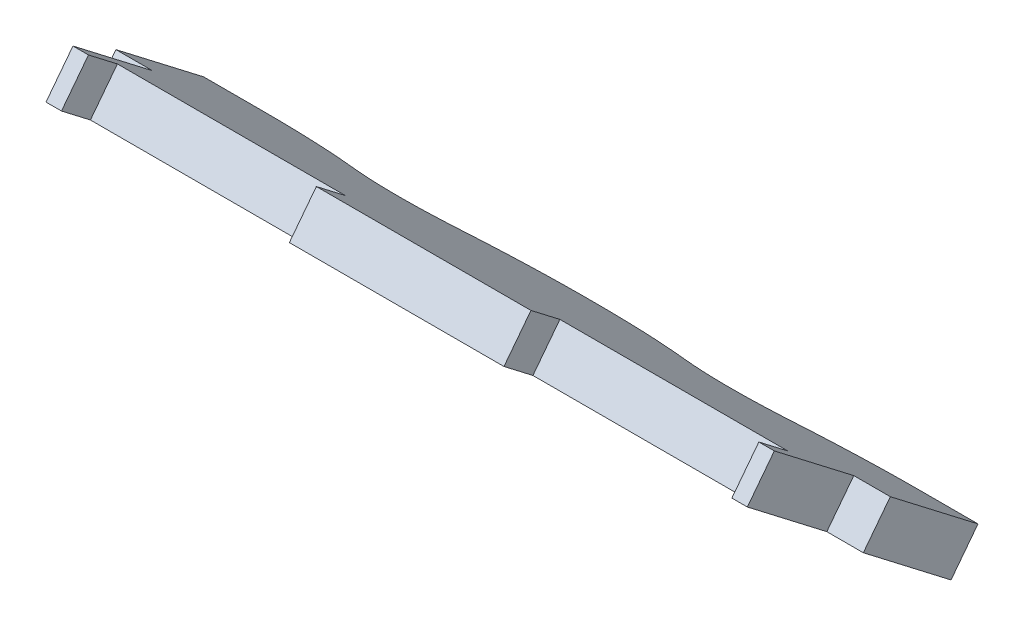
ISO-10303-21;
HEADER;
FILE_DESCRIPTION(('STEP AP214'),'2;1');
FILE_NAME('part.step','',(''),(''),'','','');
FILE_SCHEMA(('AUTOMOTIVE_DESIGN { 1 0 10303 214 1 1 1 1 }'));
ENDSEC;
DATA;
#1=APPLICATION_CONTEXT('core data for automotive mechanical design processes');
#2=APPLICATION_PROTOCOL_DEFINITION('international standard','automotive_design',2000,#1);
#3=PRODUCT_CONTEXT('',#1,'mechanical');
#4=PRODUCT('Part','Part','',(#3));
#5=PRODUCT_RELATED_PRODUCT_CATEGORY('part','',(#4));
#6=PRODUCT_DEFINITION_FORMATION('','',#4);
#7=PRODUCT_DEFINITION_CONTEXT('part definition',#1,'design');
#8=PRODUCT_DEFINITION('design','',#6,#7);
#9=PRODUCT_DEFINITION_SHAPE('','',#8);
#10=(LENGTH_UNIT() NAMED_UNIT(*) SI_UNIT(.MILLI.,.METRE.));
#11=(NAMED_UNIT(*) PLANE_ANGLE_UNIT() SI_UNIT($,.RADIAN.));
#12=(NAMED_UNIT(*) SI_UNIT($,.STERADIAN.) SOLID_ANGLE_UNIT());
#13=UNCERTAINTY_MEASURE_WITH_UNIT(LENGTH_MEASURE(1.E-05),#10,'distance_accuracy_value','');
#14=(GEOMETRIC_REPRESENTATION_CONTEXT(3) GLOBAL_UNCERTAINTY_ASSIGNED_CONTEXT((#13)) GLOBAL_UNIT_ASSIGNED_CONTEXT((#10,
#11,#12)) REPRESENTATION_CONTEXT('',''));
#15=CARTESIAN_POINT('',(0.,0.,0.));
#16=DIRECTION('',(0.,0.,1.));
#17=DIRECTION('',(1.,0.,0.));
#18=AXIS2_PLACEMENT_3D('',#15,#16,#17);
#19=CARTESIAN_POINT('',(-500000.,91.1954422490275,-51.1921997281258));
#20=DIRECTION('',(0.,-0.609506439516004,-0.792781117452051));
#21=DIRECTION('',(0.,0.792781117452051,-0.609506439516004));
#22=AXIS2_PLACEMENT_3D('',#19,#20,#21);
#23=PLANE('',#22);
#24=DIRECTION('',(1.,0.,0.));
#25=VECTOR('',#24,1.);
#26=CARTESIAN_POINT('',(-500000.,91.1954422490275,-51.1921997281258));
#27=LINE('',#26,#25);
#28=CARTESIAN_POINT('',(324.396938456516,91.1954422490275,-51.1921997281258));
#29=VERTEX_POINT('',#28);
#30=CARTESIAN_POINT('',(329.7,91.1954422490275,-51.1921997281259));
#31=VERTEX_POINT('',#30);
#32=EDGE_CURVE('E255',#29,#31,#27,.T.);
#33=ORIENTED_EDGE('',*,*,#32,.T.);
#34=DIRECTION('',(0.,-0.792781117452051,0.609506439516004));
#35=VECTOR('',#34,1.);
#36=CARTESIAN_POINT('',(329.700000000003,91.1954422490275,-51.1921997281258));
#37=LINE('',#36,#35);
#38=CARTESIAN_POINT('',(329.7,88.0243177792193,-48.7541739700619));
#39=VERTEX_POINT('',#38);
#40=EDGE_CURVE('E363',#31,#39,#37,.T.);
#41=ORIENTED_EDGE('',*,*,#40,.T.);
#42=DIRECTION('',(1.,0.,0.));
#43=VECTOR('',#42,1.);
#44=CARTESIAN_POINT('',(-500000.,88.0243177792192,-48.7541739700618));
#45=LINE('',#44,#43);
#46=CARTESIAN_POINT('',(324.396938456516,88.0243177792192,-48.7541739700618));
#47=VERTEX_POINT('',#46);
#48=EDGE_CURVE('E251',#47,#39,#45,.T.);
#49=ORIENTED_EDGE('',*,*,#48,.F.);
#50=DIRECTION('',(0.,-0.792781117452051,0.609506439516004));
#51=VECTOR('',#50,1.);
#52=CARTESIAN_POINT('',(324.396938456636,88.0243177792192,-48.7541739700618));
#53=LINE('',#52,#51);
#54=EDGE_CURVE('E302',#29,#47,#53,.T.);
#55=ORIENTED_EDGE('',*,*,#54,.F.);
#56=EDGE_LOOP('',(#33,#41,#49,#55));
#57=FACE_BOUND('',#56,.T.);
#58=ADVANCED_FACE('F44',(#57),#23,.T.);
#59=CARTESIAN_POINT('',(326.4,93.8577644056201,-40.625225670501));
#60=DIRECTION('',(0.,0.609506439516005,0.79278111745205));
#61=DIRECTION('',(0.,-0.79278111745205,0.609506439516005));
#62=AXIS2_PLACEMENT_3D('',#59,#60,#61);
#63=PLANE('',#62);
#64=DIRECTION('',(-1.,0.,0.));
#65=VECTOR('',#64,1.);
#66=CARTESIAN_POINT('',(330.7,94.1193821743793,-40.8263627955413));
#67=LINE('',#66,#65);
#68=CARTESIAN_POINT('',(329.700000000003,94.1193821743793,-40.8263627955413));
#69=VERTEX_POINT('',#68);
#70=CARTESIAN_POINT('',(326.399999999989,94.1193821743793,-40.8263627955413));
#71=VERTEX_POINT('',#70);
#72=EDGE_CURVE('E230',#69,#71,#67,.T.);
#73=ORIENTED_EDGE('',*,*,#72,.F.);
#74=DIRECTION('',(0.,0.792781117452051,-0.609506439516005));
#75=VECTOR('',#74,1.);
#76=CARTESIAN_POINT('',(329.7,93.8577644056201,-40.625225670501));
#77=LINE('',#76,#75);
#78=CARTESIAN_POINT('',(329.7,97.2905066441875,-43.2643885536053));
#79=VERTEX_POINT('',#78);
#80=EDGE_CURVE('E367',#69,#79,#77,.T.);
#81=ORIENTED_EDGE('',*,*,#80,.T.);
#82=DIRECTION('',(-1.,0.,0.));
#83=VECTOR('',#82,1.);
#84=CARTESIAN_POINT('',(326.7,97.2905066441875,-43.2643885536054));
#85=LINE('',#84,#83);
#86=CARTESIAN_POINT('',(326.4,97.2905066441875,-43.2643885536054));
#87=VERTEX_POINT('',#86);
#88=EDGE_CURVE('E243',#79,#87,#85,.T.);
#89=ORIENTED_EDGE('',*,*,#88,.T.);
#90=DIRECTION('',(0.,0.79278111745205,-0.609506439516005));
#91=VECTOR('',#90,1.);
#92=CARTESIAN_POINT('',(326.4,93.8577644056201,-40.625225670501));
#93=LINE('',#92,#91);
#94=EDGE_CURVE('E257',#71,#87,#93,.T.);
#95=ORIENTED_EDGE('',*,*,#94,.F.);
#96=EDGE_LOOP('',(#73,#81,#89,#95));
#97=FACE_BOUND('',#96,.T.);
#98=ADVANCED_FACE('F394',(#97),#63,.T.);
#99=CARTESIAN_POINT('',(259.699999999896,88.0243177792192,-48.7541739700618));
#100=VERTEX_POINT('',#99);
#101=CARTESIAN_POINT('',(265.003061543268,88.0243177792192,-48.7541739700618));
#102=VERTEX_POINT('',#101);
#103=EDGE_CURVE('E247',#100,#102,#45,.T.);
#104=ORIENTED_EDGE('',*,*,#103,.F.);
#105=DIRECTION('',(0.,0.792781117452051,-0.609506439516004));
#106=VECTOR('',#105,1.);
#107=CARTESIAN_POINT('',(259.700000000009,91.1954422490275,-51.1921997281258));
#108=LINE('',#107,#106);
#109=CARTESIAN_POINT('',(259.7,91.1954422490275,-51.1921997281259));
#110=VERTEX_POINT('',#109);
#111=EDGE_CURVE('E59',#100,#110,#108,.T.);
#112=ORIENTED_EDGE('',*,*,#111,.T.);
#113=CARTESIAN_POINT('',(265.003061543268,91.1954422490275,-51.1921997281258));
#114=VERTEX_POINT('',#113);
#115=EDGE_CURVE('E252',#110,#114,#27,.T.);
#116=ORIENTED_EDGE('',*,*,#115,.T.);
#117=DIRECTION('',(0.,-0.792781117452051,0.609506439516004));
#118=VECTOR('',#117,1.);
#119=CARTESIAN_POINT('',(265.003061543364,91.1954422490275,-51.1921997281259));
#120=LINE('',#119,#118);
#121=EDGE_CURVE('E326',#102,#114,#120,.F.);
#122=ORIENTED_EDGE('',*,*,#121,.F.);
#123=EDGE_LOOP('',(#104,#112,#116,#122));
#124=FACE_BOUND('',#123,.T.);
#125=ADVANCED_FACE('F335',(#124),#23,.T.);
#126=CARTESIAN_POINT('',(263.,93.8577644056201,-40.625225670501));
#127=DIRECTION('',(0.,-0.609506439516005,-0.79278111745205));
#128=DIRECTION('',(0.,0.79278111745205,-0.609506439516005));
#129=AXIS2_PLACEMENT_3D('',#126,#127,#128);
#130=PLANE('',#129);
#131=DIRECTION('',(0.,0.792781117452051,-0.609506439516005));
#132=VECTOR('',#131,1.);
#133=CARTESIAN_POINT('',(259.7,93.8577644056201,-40.625225670501));
#134=LINE('',#133,#132);
#135=CARTESIAN_POINT('',(259.7,94.1193821743793,-40.8263627955413));
#136=VERTEX_POINT('',#135);
#137=CARTESIAN_POINT('',(259.7,97.2905066441875,-43.2643885536054));
#138=VERTEX_POINT('',#137);
#139=EDGE_CURVE('E420',#136,#138,#134,.T.);
#140=ORIENTED_EDGE('',*,*,#139,.F.);
#141=CARTESIAN_POINT('',(262.999999999988,94.1193821743793,-40.8263627955413));
#142=VERTEX_POINT('',#141);
#143=EDGE_CURVE('E258',#142,#136,#67,.T.);
#144=ORIENTED_EDGE('',*,*,#143,.F.);
#145=DIRECTION('',(0.,0.79278111745205,-0.609506439516005));
#146=VECTOR('',#145,1.);
#147=CARTESIAN_POINT('',(263.,93.8577644056201,-40.625225670501));
#148=LINE('',#147,#146);
#149=CARTESIAN_POINT('',(263.,97.2905066441875,-43.2643885536054));
#150=VERTEX_POINT('',#149);
#151=EDGE_CURVE('E246',#142,#150,#148,.T.);
#152=ORIENTED_EDGE('',*,*,#151,.T.);
#153=DIRECTION('',(1.,0.,0.));
#154=VECTOR('',#153,1.);
#155=CARTESIAN_POINT('',(326.7,97.2905066441875,-43.2643885536054));
#156=LINE('',#155,#154);
#157=EDGE_CURVE('E249',#138,#150,#156,.T.);
#158=ORIENTED_EDGE('',*,*,#157,.F.);
#159=EDGE_LOOP('',(#140,#144,#152,#158));
#160=FACE_BOUND('',#159,.T.);
#161=ADVANCED_FACE('F442',(#160),#130,.F.);
#162=CARTESIAN_POINT('',(326.4,0.,-1.31838984174237E-13));
#163=DIRECTION('',(1.,0.,0.));
#164=DIRECTION('',(0.,0.,1.));
#165=AXIS2_PLACEMENT_3D('',#162,#163,#164);
#166=PLANE('',#165);
#167=DIRECTION('',(0.,0.609506439516005,0.792781117452051));
#168=VECTOR('',#167,1.);
#169=CARTESIAN_POINT('',(326.4,82.0528456562874,-63.0839164899066));
#170=LINE('',#169,#168);
#171=CARTESIAN_POINT('',(326.4,102.813805124188,-36.080269638516));
#172=VERTEX_POINT('',#171);
#173=EDGE_CURVE('E224',#87,#172,#170,.T.);
#174=ORIENTED_EDGE('',*,*,#173,.T.);
#175=DIRECTION('',(0.,-0.792781117452051,0.609506439516005));
#176=VECTOR('',#175,1.);
#177=CARTESIAN_POINT('',(326.4,20.7609594679003,27.0036468513905));
#178=LINE('',#177,#176);
#179=CARTESIAN_POINT('',(326.399999999978,99.6426806543794,-33.642243880452));
#180=VERTEX_POINT('',#179);
#181=EDGE_CURVE('E207',#172,#180,#178,.T.);
#182=ORIENTED_EDGE('',*,*,#181,.T.);
#183=DIRECTION('',(0.,-0.609506439516005,-0.792781117452051));
#184=VECTOR('',#183,1.);
#185=CARTESIAN_POINT('',(326.399999999978,88.0243177792192,-48.7541739700618));
#186=LINE('',#185,#184);
#187=EDGE_CURVE('E221',#180,#71,#186,.T.);
#188=ORIENTED_EDGE('',*,*,#187,.T.);
#189=ORIENTED_EDGE('',*,*,#94,.T.);
#190=EDGE_LOOP('',(#174,#182,#188,#189));
#191=FACE_BOUND('',#190,.T.);
#192=ADVANCED_FACE('F219',(#191),#166,.T.);
#193=CARTESIAN_POINT('',(325.,104.187851569314,-41.2992261265267));
#194=DIRECTION('',(1.,0.,0.));
#195=DIRECTION('',(0.,0.,1.));
#196=AXIS2_PLACEMENT_3D('',#193,#194,#195);
#197=PLANE('',#196);
#198=DIRECTION('',(0.,-0.792781117452051,0.609506439516005));
#199=VECTOR('',#198,1.);
#200=CARTESIAN_POINT('',(325.,106.199222819717,-38.683048438935));
#201=LINE('',#200,#199);
#202=CARTESIAN_POINT('',(325.,102.813805124188,-36.080269638516));
#203=VERTEX_POINT('',#202);
#204=CARTESIAN_POINT('',(325.,99.6426806543794,-33.642243880452));
#205=VERTEX_POINT('',#204);
#206=EDGE_CURVE('E210',#203,#205,#201,.T.);
#207=ORIENTED_EDGE('',*,*,#206,.F.);
#208=DIRECTION('',(0.,0.609506439516005,0.792781117452051));
#209=VECTOR('',#208,1.);
#210=CARTESIAN_POINT('',(325.,82.0528456562874,-63.0839164899066));
#211=LINE('',#210,#209);
#212=CARTESIAN_POINT('',(325.,100.802433873785,-38.6964473261078));
#213=VERTEX_POINT('',#212);
#214=EDGE_CURVE('E270',#213,#203,#211,.T.);
#215=ORIENTED_EDGE('',*,*,#214,.F.);
#216=DIRECTION('',(0.,0.792781117452052,-0.609506439516004));
#217=VECTOR('',#216,1.);
#218=CARTESIAN_POINT('',(325.,104.187851569314,-41.2992261265267));
#219=LINE('',#218,#217);
#220=CARTESIAN_POINT('',(324.999999999988,97.6313094039765,-36.2584215680437));
#221=VERTEX_POINT('',#220);
#222=EDGE_CURVE('E266',#213,#221,#219,.F.);
#223=ORIENTED_EDGE('',*,*,#222,.T.);
#224=DIRECTION('',(0.,-0.609506439516005,-0.792781117452051));
#225=VECTOR('',#224,1.);
#226=CARTESIAN_POINT('',(325.,100.252187093895,-32.849462763));
#227=LINE('',#226,#225);
#228=EDGE_CURVE('E366',#205,#221,#227,.T.);
#229=ORIENTED_EDGE('',*,*,#228,.F.);
#230=EDGE_LOOP('',(#207,#215,#223,#229));
#231=FACE_BOUND('',#230,.T.);
#232=ADVANCED_FACE('F459',(#231),#197,.F.);
#233=CARTESIAN_POINT('',(264.4,97.6313094039766,-36.2584215680437));
#234=DIRECTION('',(-1.,0.,0.));
#235=DIRECTION('',(0.,0.,-1.));
#236=AXIS2_PLACEMENT_3D('',#233,#234,#235);
#237=PLANE('',#236);
#238=DIRECTION('',(0.,0.792781117452051,-0.609506439516005));
#239=VECTOR('',#238,1.);
#240=CARTESIAN_POINT('',(264.4,99.6426806543793,-33.642243880452));
#241=LINE('',#240,#239);
#242=CARTESIAN_POINT('',(264.400000000023,99.6426806543794,-33.642243880452));
#243=VERTEX_POINT('',#242);
#244=CARTESIAN_POINT('',(264.4,102.813805124188,-36.080269638516));
#245=VERTEX_POINT('',#244);
#246=EDGE_CURVE('E415',#243,#245,#241,.T.);
#247=ORIENTED_EDGE('',*,*,#246,.F.);
#248=DIRECTION('',(0.,0.609506439516005,0.792781117452051));
#249=VECTOR('',#248,1.);
#250=CARTESIAN_POINT('',(264.4,97.6313094039766,-36.2584215680438));
#251=LINE('',#250,#249);
#252=CARTESIAN_POINT('',(264.4,97.6313094039766,-36.2584215680437));
#253=VERTEX_POINT('',#252);
#254=EDGE_CURVE('E379',#253,#243,#251,.T.);
#255=ORIENTED_EDGE('',*,*,#254,.F.);
#256=DIRECTION('',(0.,0.792781117452052,-0.609506439516004));
#257=VECTOR('',#256,1.);
#258=CARTESIAN_POINT('',(264.4,97.6313094039766,-36.2584215680437));
#259=LINE('',#258,#257);
#260=CARTESIAN_POINT('',(264.4,100.802433873785,-38.6964473261078));
#261=VERTEX_POINT('',#260);
#262=EDGE_CURVE('E279',#253,#261,#259,.T.);
#263=ORIENTED_EDGE('',*,*,#262,.T.);
#264=DIRECTION('',(0.,-0.609506439516005,-0.792781117452051));
#265=VECTOR('',#264,1.);
#266=CARTESIAN_POINT('',(264.4,82.0528456562874,-63.0839164899066));
#267=LINE('',#266,#265);
#268=EDGE_CURVE('E281',#245,#261,#267,.T.);
#269=ORIENTED_EDGE('',*,*,#268,.F.);
#270=EDGE_LOOP('',(#247,#255,#263,#269));
#271=FACE_BOUND('',#270,.T.);
#272=ADVANCED_FACE('F549',(#271),#237,.F.);
#273=CARTESIAN_POINT('',(263.,0.,0.));
#274=DIRECTION('',(1.,0.,0.));
#275=DIRECTION('',(0.,0.,1.));
#276=AXIS2_PLACEMENT_3D('',#273,#274,#275);
#277=PLANE('',#276);
#278=DIRECTION('',(0.,-0.792781117452051,0.609506439516005));
#279=VECTOR('',#278,1.);
#280=CARTESIAN_POINT('',(263.,20.7609594679002,27.0036468513906));
#281=LINE('',#280,#279);
#282=CARTESIAN_POINT('',(263.,102.813805124188,-36.080269638516));
#283=VERTEX_POINT('',#282);
#284=CARTESIAN_POINT('',(262.999999999977,99.6426806543794,-33.642243880452));
#285=VERTEX_POINT('',#284);
#286=EDGE_CURVE('E67',#283,#285,#281,.T.);
#287=ORIENTED_EDGE('',*,*,#286,.F.);
#288=DIRECTION('',(0.,-0.609506439516005,-0.792781117452051));
#289=VECTOR('',#288,1.);
#290=CARTESIAN_POINT('',(263.,82.0528456562874,-63.0839164899066));
#291=LINE('',#290,#289);
#292=EDGE_CURVE('E236',#283,#150,#291,.T.);
#293=ORIENTED_EDGE('',*,*,#292,.T.);
#294=ORIENTED_EDGE('',*,*,#151,.F.);
#295=DIRECTION('',(0.,0.609506439516005,0.792781117452051));
#296=VECTOR('',#295,1.);
#297=CARTESIAN_POINT('',(262.999999999977,88.0243177792192,-48.7541739700618));
#298=LINE('',#297,#296);
#299=EDGE_CURVE('E232',#142,#285,#298,.T.);
#300=ORIENTED_EDGE('',*,*,#299,.T.);
#301=EDGE_LOOP('',(#287,#293,#294,#300));
#302=FACE_BOUND('',#301,.T.);
#303=ADVANCED_FACE('F558',(#302),#277,.F.);
#304=CARTESIAN_POINT('',(304.4,97.6313094039765,-36.2584215680437));
#305=DIRECTION('',(-1.,0.,0.));
#306=DIRECTION('',(0.,0.,-1.));
#307=AXIS2_PLACEMENT_3D('',#304,#305,#306);
#308=PLANE('',#307);
#309=DIRECTION('',(0.,0.792781117452051,-0.609506439516005));
#310=VECTOR('',#309,1.);
#311=CARTESIAN_POINT('',(304.4,99.6426806543793,-33.642243880452));
#312=LINE('',#311,#310);
#313=CARTESIAN_POINT('',(304.399999999987,99.6426806543794,-33.642243880452));
#314=VERTEX_POINT('',#313);
#315=CARTESIAN_POINT('',(304.4,102.813805124188,-36.080269638516));
#316=VERTEX_POINT('',#315);
#317=EDGE_CURVE('E404',#314,#316,#312,.T.);
#318=ORIENTED_EDGE('',*,*,#317,.F.);
#319=DIRECTION('',(0.,0.609506439516005,0.792781117452051));
#320=VECTOR('',#319,1.);
#321=CARTESIAN_POINT('',(304.4,97.6313094039766,-36.2584215680438));
#322=LINE('',#321,#320);
#323=CARTESIAN_POINT('',(304.4,97.6313094039766,-36.2584215680437));
#324=VERTEX_POINT('',#323);
#325=EDGE_CURVE('E376',#324,#314,#322,.T.);
#326=ORIENTED_EDGE('',*,*,#325,.F.);
#327=DIRECTION('',(0.,0.792781117452052,-0.609506439516004));
#328=VECTOR('',#327,1.);
#329=CARTESIAN_POINT('',(304.4,97.6313094039765,-36.2584215680437));
#330=LINE('',#329,#328);
#331=CARTESIAN_POINT('',(304.4,100.802433873785,-38.6964473261078));
#332=VERTEX_POINT('',#331);
#333=EDGE_CURVE('E271',#324,#332,#330,.T.);
#334=ORIENTED_EDGE('',*,*,#333,.T.);
#335=DIRECTION('',(0.,-0.609506439516005,-0.792781117452051));
#336=VECTOR('',#335,1.);
#337=CARTESIAN_POINT('',(304.4,82.0528456562874,-63.0839164899066));
#338=LINE('',#337,#336);
#339=EDGE_CURVE('E388',#316,#332,#338,.T.);
#340=ORIENTED_EDGE('',*,*,#339,.F.);
#341=EDGE_LOOP('',(#318,#326,#334,#340));
#342=FACE_BOUND('',#341,.T.);
#343=ADVANCED_FACE('F568',(#342),#308,.F.);
#344=CARTESIAN_POINT('',(285.,104.187851569314,-41.2992261265267));
#345=DIRECTION('',(1.,0.,0.));
#346=DIRECTION('',(0.,0.,1.));
#347=AXIS2_PLACEMENT_3D('',#344,#345,#346);
#348=PLANE('',#347);
#349=DIRECTION('',(0.,-0.792781117452051,0.609506439516005));
#350=VECTOR('',#349,1.);
#351=CARTESIAN_POINT('',(285.,106.199222819717,-38.683048438935));
#352=LINE('',#351,#350);
#353=CARTESIAN_POINT('',(285.,102.813805124188,-36.080269638516));
#354=VERTEX_POINT('',#353);
#355=CARTESIAN_POINT('',(285.,99.6426806543794,-33.642243880452));
#356=VERTEX_POINT('',#355);
#357=EDGE_CURVE('E406',#354,#356,#352,.T.);
#358=ORIENTED_EDGE('',*,*,#357,.F.);
#359=DIRECTION('',(0.,0.609506439516005,0.792781117452051));
#360=VECTOR('',#359,1.);
#361=CARTESIAN_POINT('',(285.,82.0528456562874,-63.0839164899066));
#362=LINE('',#361,#360);
#363=CARTESIAN_POINT('',(285.,100.802433873785,-38.6964473261078));
#364=VERTEX_POINT('',#363);
#365=EDGE_CURVE('E278',#364,#354,#362,.T.);
#366=ORIENTED_EDGE('',*,*,#365,.F.);
#367=DIRECTION('',(0.,0.792781117452052,-0.609506439516004));
#368=VECTOR('',#367,1.);
#369=CARTESIAN_POINT('',(285.,104.187851569314,-41.2992261265267));
#370=LINE('',#369,#368);
#371=CARTESIAN_POINT('',(285.000000000025,97.6313094039769,-36.258421568044));
#372=VERTEX_POINT('',#371);
#373=EDGE_CURVE('E275',#364,#372,#370,.F.);
#374=ORIENTED_EDGE('',*,*,#373,.T.);
#375=DIRECTION('',(0.,-0.609506439516005,-0.792781117452051));
#376=VECTOR('',#375,1.);
#377=CARTESIAN_POINT('',(285.,100.252187093895,-32.849462763));
#378=LINE('',#377,#376);
#379=EDGE_CURVE('E369',#356,#372,#378,.T.);
#380=ORIENTED_EDGE('',*,*,#379,.F.);
#381=EDGE_LOOP('',(#358,#366,#374,#380));
#382=FACE_BOUND('',#381,.T.);
#383=ADVANCED_FACE('F578',(#382),#348,.F.);
#384=CARTESIAN_POINT('',(326.7,82.0528456562874,-63.0839164899066));
#385=DIRECTION('',(0.,0.792781117452051,-0.609506439516005));
#386=DIRECTION('',(0.,0.609506439516005,0.792781117452051));
#387=AXIS2_PLACEMENT_3D('',#384,#385,#386);
#388=PLANE('',#387);
#389=ORIENTED_EDGE('',*,*,#88,.F.);
#390=DIRECTION('',(0.,-0.609506439516005,-0.792781117452051));
#391=VECTOR('',#390,1.);
#392=CARTESIAN_POINT('',(329.7,82.0528456562874,-63.0839164899066));
#393=LINE('',#392,#391);
#394=EDGE_CURVE('E372',#79,#31,#393,.T.);
#395=ORIENTED_EDGE('',*,*,#394,.T.);
#396=ORIENTED_EDGE('',*,*,#32,.F.);
#397=CARTESIAN_POINT('',(324.396938456636,106.433103236928,-31.3726717918246));
#398=DIRECTION('',(0.,-0.792781117452051,0.609506439516005));
#399=DIRECTION('',(0.,0.609506439516005,0.792781117452051));
#400=AXIS2_PLACEMENT_3D('',#397,#398,#399);
#401=CIRCLE('',#400,25.);
#402=CARTESIAN_POINT('',(314.598979485504,92.4144551280595,-49.6066374932218));
#403=VERTEX_POINT('',#402);
#404=EDGE_CURVE('E300',#403,#29,#401,.T.);
#405=ORIENTED_EDGE('',*,*,#404,.F.);
#406=CARTESIAN_POINT('',(309.699999999937,85.4051310736254,-58.7236203439204));
#407=DIRECTION('',(0.,-0.792781117452051,0.609506439516005));
#408=DIRECTION('',(0.,-0.609506439516005,-0.792781117452051));
#409=AXIS2_PLACEMENT_3D('',#406,#407,#408);
#410=CIRCLE('',#409,12.5);
#411=CARTESIAN_POINT('',(304.801020514371,92.4144551280595,-49.6066374932218));
#412=VERTEX_POINT('',#411);
#413=EDGE_CURVE('E383',#403,#412,#410,.T.);
#414=ORIENTED_EDGE('',*,*,#413,.T.);
#415=CARTESIAN_POINT('',(295.003061543238,106.433103236928,-31.3726717918246));
#416=DIRECTION('',(0.,-0.792781117452051,0.609506439516005));
#417=DIRECTION('',(0.,0.609506439516005,0.792781117452051));
#418=AXIS2_PLACEMENT_3D('',#415,#416,#417);
#419=CIRCLE('',#418,25.);
#420=CARTESIAN_POINT('',(295.003061543127,91.1954422490275,-51.1921997281258));
#421=VERTEX_POINT('',#420);
#422=EDGE_CURVE('E297',#421,#412,#419,.T.);
#423=ORIENTED_EDGE('',*,*,#422,.F.);
#424=CARTESIAN_POINT('',(294.396938456657,91.1954422490275,-51.1921997281258));
#425=VERTEX_POINT('',#424);
#426=EDGE_CURVE('E254',#425,#421,#27,.T.);
#427=ORIENTED_EDGE('',*,*,#426,.F.);
#428=CARTESIAN_POINT('',(294.396938456762,106.433103236928,-31.3726717918246));
#429=DIRECTION('',(0.,-0.792781117452051,0.609506439516005));
#430=DIRECTION('',(0.,0.609506439516005,0.792781117452051));
#431=AXIS2_PLACEMENT_3D('',#428,#429,#430);
#432=CIRCLE('',#431,25.);
#433=CARTESIAN_POINT('',(284.598979485629,92.4144551280595,-49.6066374932218));
#434=VERTEX_POINT('',#433);
#435=EDGE_CURVE('E295',#434,#425,#432,.T.);
#436=ORIENTED_EDGE('',*,*,#435,.F.);
#437=CARTESIAN_POINT('',(279.700000000063,85.4051310736254,-58.7236203439204));
#438=DIRECTION('',(0.,-0.792781117452051,0.609506439516005));
#439=DIRECTION('',(0.,0.609506439516005,0.792781117452051));
#440=AXIS2_PLACEMENT_3D('',#437,#438,#439);
#441=CIRCLE('',#440,12.5);
#442=CARTESIAN_POINT('',(274.801020514496,92.4144551280595,-49.6066374932218));
#443=VERTEX_POINT('',#442);
#444=EDGE_CURVE('E345',#434,#443,#441,.T.);
#445=ORIENTED_EDGE('',*,*,#444,.T.);
#446=CARTESIAN_POINT('',(265.003061543364,106.433103236928,-31.3726717918246));
#447=DIRECTION('',(0.,-0.792781117452051,0.609506439516005));
#448=DIRECTION('',(0.,0.609506439516005,0.792781117452051));
#449=AXIS2_PLACEMENT_3D('',#446,#447,#448);
#450=CIRCLE('',#449,25.);
#451=EDGE_CURVE('E292',#114,#443,#450,.T.);
#452=ORIENTED_EDGE('',*,*,#451,.F.);
#453=ORIENTED_EDGE('',*,*,#115,.F.);
#454=DIRECTION('',(0.,0.609506439516005,0.792781117452051));
#455=VECTOR('',#454,1.);
#456=CARTESIAN_POINT('',(259.7,82.0528456562874,-63.0839164899066));
#457=LINE('',#456,#455);
#458=EDGE_CURVE('E417',#110,#138,#457,.T.);
#459=ORIENTED_EDGE('',*,*,#458,.T.);
#460=ORIENTED_EDGE('',*,*,#157,.T.);
#461=ORIENTED_EDGE('',*,*,#292,.F.);
#462=DIRECTION('',(1.,0.,0.));
#463=VECTOR('',#462,1.);
#464=CARTESIAN_POINT('',(326.7,102.813805124188,-36.080269638516));
#465=LINE('',#464,#463);
#466=EDGE_CURVE('E401',#283,#245,#465,.T.);
#467=ORIENTED_EDGE('',*,*,#466,.T.);
#468=ORIENTED_EDGE('',*,*,#268,.T.);
#469=DIRECTION('',(1.,0.,0.));
#470=VECTOR('',#469,1.);
#471=CARTESIAN_POINT('',(326.7,100.802433873785,-38.6964473261078));
#472=LINE('',#471,#470);
#473=EDGE_CURVE('E267',#261,#364,#472,.T.);
#474=ORIENTED_EDGE('',*,*,#473,.T.);
#475=ORIENTED_EDGE('',*,*,#365,.T.);
#476=EDGE_CURVE('E225',#354,#316,#465,.T.);
#477=ORIENTED_EDGE('',*,*,#476,.T.);
#478=ORIENTED_EDGE('',*,*,#339,.T.);
#479=EDGE_CURVE('E264',#332,#213,#472,.T.);
#480=ORIENTED_EDGE('',*,*,#479,.T.);
#481=ORIENTED_EDGE('',*,*,#214,.T.);
#482=EDGE_CURVE('E398',#203,#172,#465,.T.);
#483=ORIENTED_EDGE('',*,*,#482,.T.);
#484=ORIENTED_EDGE('',*,*,#173,.F.);
#485=EDGE_LOOP('',(#389,#395,#396,#405,#414,#423,#427,#436,#445,#452,#453,#459,#460,#461,#467,
#468,#474,#475,#477,#478,#480,#481,#483,#484));
#486=FACE_BOUND('',#485,.T.);
#487=ADVANCED_FACE('F397',(#486),#388,.T.);
#488=CARTESIAN_POINT('',(-500000.,88.0243177792192,-48.7541739700618));
#489=DIRECTION('',(0.,-0.792781117452051,0.609506439516005));
#490=DIRECTION('',(0.,-0.609506439516005,-0.792781117452051));
#491=AXIS2_PLACEMENT_3D('',#488,#489,#490);
#492=PLANE('',#491);
#493=ORIENTED_EDGE('',*,*,#48,.T.);
#494=DIRECTION('',(0.,0.609506439516005,0.792781117452051));
#495=VECTOR('',#494,1.);
#496=CARTESIAN_POINT('',(329.700000000003,88.0243177792192,-48.7541739700618));
#497=LINE('',#496,#495);
#498=EDGE_CURVE('E12',#39,#69,#497,.T.);
#499=ORIENTED_EDGE('',*,*,#498,.T.);
#500=ORIENTED_EDGE('',*,*,#72,.T.);
#501=ORIENTED_EDGE('',*,*,#187,.F.);
#502=DIRECTION('',(-1.,0.,0.));
#503=VECTOR('',#502,1.);
#504=CARTESIAN_POINT('',(-500000.,99.6426806543794,-33.642243880452));
#505=LINE('',#504,#503);
#506=EDGE_CURVE('E204',#180,#205,#505,.T.);
#507=ORIENTED_EDGE('',*,*,#506,.T.);
#508=ORIENTED_EDGE('',*,*,#228,.T.);
#509=DIRECTION('',(1.,0.,0.));
#510=VECTOR('',#509,1.);
#511=CARTESIAN_POINT('',(324.7,97.6313094039765,-36.2584215680437));
#512=LINE('',#511,#510);
#513=EDGE_CURVE('E239',#324,#221,#512,.T.);
#514=ORIENTED_EDGE('',*,*,#513,.F.);
#515=ORIENTED_EDGE('',*,*,#325,.T.);
#516=EDGE_CURVE('E214',#314,#356,#505,.T.);
#517=ORIENTED_EDGE('',*,*,#516,.T.);
#518=ORIENTED_EDGE('',*,*,#379,.T.);
#519=EDGE_CURVE('E233',#253,#372,#512,.T.);
#520=ORIENTED_EDGE('',*,*,#519,.F.);
#521=ORIENTED_EDGE('',*,*,#254,.T.);
#522=EDGE_CURVE('E216',#243,#285,#505,.T.);
#523=ORIENTED_EDGE('',*,*,#522,.T.);
#524=ORIENTED_EDGE('',*,*,#299,.F.);
#525=ORIENTED_EDGE('',*,*,#143,.T.);
#526=DIRECTION('',(0.,-0.609506439516005,-0.792781117452051));
#527=VECTOR('',#526,1.);
#528=CARTESIAN_POINT('',(259.700000000009,88.0243177792192,-48.7541739700618));
#529=LINE('',#528,#527);
#530=EDGE_CURVE('E52',#136,#100,#529,.T.);
#531=ORIENTED_EDGE('',*,*,#530,.T.);
#532=ORIENTED_EDGE('',*,*,#103,.T.);
#533=CARTESIAN_POINT('',(265.003061543364,103.261978767119,-28.9346460337606));
#534=DIRECTION('',(0.,0.792781117452051,-0.609506439516005));
#535=DIRECTION('',(0.,-0.609506439516005,-0.792781117452051));
#536=AXIS2_PLACEMENT_3D('',#533,#534,#535);
#537=CIRCLE('',#536,25.);
#538=CARTESIAN_POINT('',(274.801020514496,89.2433306582512,-47.1686117351577));
#539=VERTEX_POINT('',#538);
#540=EDGE_CURVE('E305',#539,#102,#537,.T.);
#541=ORIENTED_EDGE('',*,*,#540,.F.);
#542=CARTESIAN_POINT('',(279.700000000063,82.2340066038172,-56.2855945858563));
#543=DIRECTION('',(0.,0.792781117452051,-0.609506439516005));
#544=DIRECTION('',(0.,-0.609506439516005,-0.792781117452051));
#545=AXIS2_PLACEMENT_3D('',#542,#543,#544);
#546=CIRCLE('',#545,12.5);
#547=CARTESIAN_POINT('',(284.598979485629,89.2433306582512,-47.1686117351577));
#548=VERTEX_POINT('',#547);
#549=EDGE_CURVE('E274',#539,#548,#546,.T.);
#550=ORIENTED_EDGE('',*,*,#549,.T.);
#551=CARTESIAN_POINT('',(294.396938456762,103.261978767119,-28.9346460337606));
#552=DIRECTION('',(0.,0.792781117452051,-0.609506439516005));
#553=DIRECTION('',(0.,-0.609506439516005,-0.792781117452051));
#554=AXIS2_PLACEMENT_3D('',#551,#552,#553);
#555=CIRCLE('',#554,25.);
#556=CARTESIAN_POINT('',(294.396938456657,88.0243177792192,-48.7541739700618));
#557=VERTEX_POINT('',#556);
#558=EDGE_CURVE('E308',#557,#548,#555,.T.);
#559=ORIENTED_EDGE('',*,*,#558,.F.);
#560=CARTESIAN_POINT('',(295.003061543127,88.0243177792192,-48.7541739700618));
#561=VERTEX_POINT('',#560);
#562=EDGE_CURVE('E250',#557,#561,#45,.T.);
#563=ORIENTED_EDGE('',*,*,#562,.T.);
#564=CARTESIAN_POINT('',(295.003061543238,103.261978767119,-28.9346460337606));
#565=DIRECTION('',(0.,0.792781117452051,-0.609506439516005));
#566=DIRECTION('',(0.,-0.609506439516005,-0.792781117452051));
#567=AXIS2_PLACEMENT_3D('',#564,#565,#566);
#568=CIRCLE('',#567,25.);
#569=CARTESIAN_POINT('',(304.801020514371,89.2433306582512,-47.1686117351577));
#570=VERTEX_POINT('',#569);
#571=EDGE_CURVE('E311',#570,#561,#568,.T.);
#572=ORIENTED_EDGE('',*,*,#571,.F.);
#573=CARTESIAN_POINT('',(309.699999999937,82.2340066038172,-56.2855945858563));
#574=DIRECTION('',(0.,0.792781117452051,-0.609506439516005));
#575=DIRECTION('',(0.,-0.609506439516005,-0.792781117452051));
#576=AXIS2_PLACEMENT_3D('',#573,#574,#575);
#577=CIRCLE('',#576,12.5);
#578=CARTESIAN_POINT('',(314.598979485504,89.2433306582512,-47.1686117351577));
#579=VERTEX_POINT('',#578);
#580=EDGE_CURVE('E285',#570,#579,#577,.T.);
#581=ORIENTED_EDGE('',*,*,#580,.T.);
#582=CARTESIAN_POINT('',(324.396938456636,103.261978767119,-28.9346460337606));
#583=DIRECTION('',(0.,0.792781117452051,-0.609506439516005));
#584=DIRECTION('',(0.,-0.609506439516005,-0.792781117452051));
#585=AXIS2_PLACEMENT_3D('',#582,#583,#584);
#586=CIRCLE('',#585,25.);
#587=EDGE_CURVE('E313',#47,#579,#586,.T.);
#588=ORIENTED_EDGE('',*,*,#587,.F.);
#589=EDGE_LOOP('',(#493,#499,#500,#501,#507,#508,#514,#515,#517,#518,#520,#521,#523,#524,#525,
#531,#532,#541,#550,#559,#563,#572,#581,#588));
#590=FACE_BOUND('',#589,.T.);
#591=ADVANCED_FACE('F228',(#590),#492,.T.);
#592=CARTESIAN_POINT('',(0.,18.7495882174973,24.3874691637988));
#593=DIRECTION('',(0.,-0.609506439516004,-0.792781117452052));
#594=DIRECTION('',(1.,0.,0.));
#595=AXIS2_PLACEMENT_3D('',#592,#593,#594);
#596=PLANE('',#595);
#597=ORIENTED_EDGE('',*,*,#513,.T.);
#598=ORIENTED_EDGE('',*,*,#222,.F.);
#599=ORIENTED_EDGE('',*,*,#479,.F.);
#600=ORIENTED_EDGE('',*,*,#333,.F.);
#601=EDGE_LOOP('',(#597,#598,#599,#600));
#602=FACE_BOUND('',#601,.T.);
#603=ADVANCED_FACE('F451',(#602),#596,.F.);
#604=ORIENTED_EDGE('',*,*,#519,.T.);
#605=ORIENTED_EDGE('',*,*,#373,.F.);
#606=ORIENTED_EDGE('',*,*,#473,.F.);
#607=ORIENTED_EDGE('',*,*,#262,.F.);
#608=EDGE_LOOP('',(#604,#605,#606,#607));
#609=FACE_BOUND('',#608,.T.);
#610=ADVANCED_FACE('F444',(#609),#596,.F.);
#611=ORIENTED_EDGE('',*,*,#562,.F.);
#612=DIRECTION('',(0.,-0.792781117452051,0.609506439516004));
#613=VECTOR('',#612,1.);
#614=CARTESIAN_POINT('',(294.396938456762,88.0243177792192,-48.7541739700618));
#615=LINE('',#614,#613);
#616=EDGE_CURVE('E316',#425,#557,#615,.T.);
#617=ORIENTED_EDGE('',*,*,#616,.F.);
#618=ORIENTED_EDGE('',*,*,#426,.T.);
#619=DIRECTION('',(0.,-0.792781117452051,0.609506439516004));
#620=VECTOR('',#619,1.);
#621=CARTESIAN_POINT('',(295.003061543238,91.1954422490275,-51.1921997281259));
#622=LINE('',#621,#620);
#623=EDGE_CURVE('E319',#561,#421,#622,.F.);
#624=ORIENTED_EDGE('',*,*,#623,.F.);
#625=EDGE_LOOP('',(#611,#617,#618,#624));
#626=FACE_BOUND('',#625,.T.);
#627=ADVANCED_FACE('F355',(#626),#23,.T.);
#628=CARTESIAN_POINT('',(279.700000000063,77.4773198991049,-52.6285559487603));
#629=DIRECTION('',(0.,0.792781117452051,-0.609506439516005));
#630=DIRECTION('',(0.,0.609506439516005,0.792781117452051));
#631=AXIS2_PLACEMENT_3D('',#628,#629,#630);
#632=CYLINDRICAL_SURFACE('',#631,12.5);
#633=ORIENTED_EDGE('',*,*,#549,.F.);
#634=DIRECTION('',(0.,0.792781117452051,-0.609506439516005));
#635=VECTOR('',#634,1.);
#636=CARTESIAN_POINT('',(274.801020514496,84.486643953539,-43.5115730980617));
#637=LINE('',#636,#635);
#638=EDGE_CURVE('E322',#443,#539,#637,.F.);
#639=ORIENTED_EDGE('',*,*,#638,.F.);
#640=ORIENTED_EDGE('',*,*,#444,.F.);
#641=DIRECTION('',(0.,0.792781117452051,-0.609506439516005));
#642=VECTOR('',#641,1.);
#643=CARTESIAN_POINT('',(284.598979485629,84.486643953539,-43.5115730980617));
#644=LINE('',#643,#642);
#645=EDGE_CURVE('E324',#548,#434,#644,.T.);
#646=ORIENTED_EDGE('',*,*,#645,.F.);
#647=EDGE_LOOP('',(#633,#639,#640,#646));
#648=FACE_BOUND('',#647,.T.);
#649=ADVANCED_FACE('F343',(#648),#632,.F.);
#650=CARTESIAN_POINT('',(309.699999999937,77.4773198991049,-52.6285559487603));
#651=DIRECTION('',(0.,0.792781117452051,-0.609506439516005));
#652=DIRECTION('',(0.,0.609506439516005,0.792781117452051));
#653=AXIS2_PLACEMENT_3D('',#650,#651,#652);
#654=CYLINDRICAL_SURFACE('',#653,12.5);
#655=ORIENTED_EDGE('',*,*,#580,.F.);
#656=DIRECTION('',(0.,0.792781117452051,-0.609506439516005));
#657=VECTOR('',#656,1.);
#658=CARTESIAN_POINT('',(304.801020514371,84.486643953539,-43.5115730980617));
#659=LINE('',#658,#657);
#660=EDGE_CURVE('E288',#412,#570,#659,.F.);
#661=ORIENTED_EDGE('',*,*,#660,.F.);
#662=ORIENTED_EDGE('',*,*,#413,.F.);
#663=DIRECTION('',(0.,0.792781117452051,-0.609506439516005));
#664=VECTOR('',#663,1.);
#665=CARTESIAN_POINT('',(314.598979485504,84.486643953539,-43.5115730980617));
#666=LINE('',#665,#664);
#667=EDGE_CURVE('E290',#579,#403,#666,.T.);
#668=ORIENTED_EDGE('',*,*,#667,.F.);
#669=EDGE_LOOP('',(#655,#661,#662,#668));
#670=FACE_BOUND('',#669,.T.);
#671=ADVANCED_FACE('F449',(#670),#654,.F.);
#672=CARTESIAN_POINT('',(324.396938456636,98.5052920624071,-25.2776073966646));
#673=DIRECTION('',(0.,0.792781117452051,-0.609506439516005));
#674=DIRECTION('',(0.,0.609506439516005,0.792781117452051));
#675=AXIS2_PLACEMENT_3D('',#672,#673,#674);
#676=CYLINDRICAL_SURFACE('',#675,25.);
#677=ORIENTED_EDGE('',*,*,#587,.T.);
#678=ORIENTED_EDGE('',*,*,#667,.T.);
#679=ORIENTED_EDGE('',*,*,#404,.T.);
#680=ORIENTED_EDGE('',*,*,#54,.T.);
#681=EDGE_LOOP('',(#677,#678,#679,#680));
#682=FACE_BOUND('',#681,.T.);
#683=ADVANCED_FACE('F463',(#682),#676,.T.);
#684=CARTESIAN_POINT('',(295.003061543238,98.5052920624071,-25.2776073966646));
#685=DIRECTION('',(0.,0.792781117452051,-0.609506439516005));
#686=DIRECTION('',(0.,0.609506439516005,0.792781117452051));
#687=AXIS2_PLACEMENT_3D('',#684,#685,#686);
#688=CYLINDRICAL_SURFACE('',#687,25.);
#689=ORIENTED_EDGE('',*,*,#422,.T.);
#690=ORIENTED_EDGE('',*,*,#660,.T.);
#691=ORIENTED_EDGE('',*,*,#571,.T.);
#692=ORIENTED_EDGE('',*,*,#623,.T.);
#693=EDGE_LOOP('',(#689,#690,#691,#692));
#694=FACE_BOUND('',#693,.T.);
#695=ADVANCED_FACE('F466',(#694),#688,.T.);
#696=CARTESIAN_POINT('',(294.396938456762,98.5052920624071,-25.2776073966646));
#697=DIRECTION('',(0.,0.792781117452051,-0.609506439516005));
#698=DIRECTION('',(0.,0.609506439516005,0.792781117452051));
#699=AXIS2_PLACEMENT_3D('',#696,#697,#698);
#700=CYLINDRICAL_SURFACE('',#699,25.);
#701=ORIENTED_EDGE('',*,*,#558,.T.);
#702=ORIENTED_EDGE('',*,*,#645,.T.);
#703=ORIENTED_EDGE('',*,*,#435,.T.);
#704=ORIENTED_EDGE('',*,*,#616,.T.);
#705=EDGE_LOOP('',(#701,#702,#703,#704));
#706=FACE_BOUND('',#705,.T.);
#707=ADVANCED_FACE('F348',(#706),#700,.T.);
#708=CARTESIAN_POINT('',(265.003061543364,98.5052920624071,-25.2776073966646));
#709=DIRECTION('',(0.,0.792781117452051,-0.609506439516005));
#710=DIRECTION('',(0.,0.609506439516005,0.792781117452051));
#711=AXIS2_PLACEMENT_3D('',#708,#709,#710);
#712=CYLINDRICAL_SURFACE('',#711,25.);
#713=ORIENTED_EDGE('',*,*,#451,.T.);
#714=ORIENTED_EDGE('',*,*,#638,.T.);
#715=ORIENTED_EDGE('',*,*,#540,.T.);
#716=ORIENTED_EDGE('',*,*,#121,.T.);
#717=EDGE_LOOP('',(#713,#714,#715,#716));
#718=FACE_BOUND('',#717,.T.);
#719=ADVANCED_FACE('F46',(#718),#712,.T.);
#720=CARTESIAN_POINT('',(259.7,107.5704918289,-39.7373082756121));
#721=DIRECTION('',(0.,0.609506439516005,0.792781117452051));
#722=DIRECTION('',(0.,-0.792781117452051,0.609506439516005));
#723=AXIS2_PLACEMENT_3D('',#720,#721,#722);
#724=PLANE('',#723);
#725=ORIENTED_EDGE('',*,*,#246,.T.);
#726=ORIENTED_EDGE('',*,*,#466,.F.);
#727=ORIENTED_EDGE('',*,*,#286,.T.);
#728=ORIENTED_EDGE('',*,*,#522,.F.);
#729=EDGE_LOOP('',(#725,#726,#727,#728));
#730=FACE_BOUND('',#729,.T.);
#731=ADVANCED_FACE('F474',(#730),#724,.T.);
#732=ORIENTED_EDGE('',*,*,#317,.T.);
#733=ORIENTED_EDGE('',*,*,#476,.F.);
#734=ORIENTED_EDGE('',*,*,#357,.T.);
#735=ORIENTED_EDGE('',*,*,#516,.F.);
#736=EDGE_LOOP('',(#732,#733,#734,#735));
#737=FACE_BOUND('',#736,.T.);
#738=ADVANCED_FACE('F479',(#737),#724,.T.);
#739=ORIENTED_EDGE('',*,*,#482,.F.);
#740=ORIENTED_EDGE('',*,*,#206,.T.);
#741=ORIENTED_EDGE('',*,*,#506,.F.);
#742=ORIENTED_EDGE('',*,*,#181,.F.);
#743=EDGE_LOOP('',(#739,#740,#741,#742));
#744=FACE_BOUND('',#743,.T.);
#745=ADVANCED_FACE('F206',(#744),#724,.T.);
#746=CARTESIAN_POINT('',(259.7,93.6011334476297,-57.9071631443903));
#747=DIRECTION('',(-1.,0.,0.));
#748=DIRECTION('',(0.,-1.,0.));
#749=AXIS2_PLACEMENT_3D('',#746,#747,#748);
#750=PLANE('',#749);
#751=ORIENTED_EDGE('',*,*,#530,.F.);
#752=ORIENTED_EDGE('',*,*,#139,.T.);
#753=ORIENTED_EDGE('',*,*,#458,.F.);
#754=ORIENTED_EDGE('',*,*,#111,.F.);
#755=EDGE_LOOP('',(#751,#752,#753,#754));
#756=FACE_BOUND('',#755,.T.);
#757=ADVANCED_FACE('F425',(#756),#750,.T.);
#758=CARTESIAN_POINT('',(329.7,93.6011334476297,-57.9071631443903));
#759=DIRECTION('',(1.,0.,0.));
#760=DIRECTION('',(0.,1.,0.));
#761=AXIS2_PLACEMENT_3D('',#758,#759,#760);
#762=PLANE('',#761);
#763=ORIENTED_EDGE('',*,*,#394,.F.);
#764=ORIENTED_EDGE('',*,*,#80,.F.);
#765=ORIENTED_EDGE('',*,*,#498,.F.);
#766=ORIENTED_EDGE('',*,*,#40,.F.);
#767=EDGE_LOOP('',(#763,#764,#765,#766));
#768=FACE_BOUND('',#767,.T.);
#769=ADVANCED_FACE('F423',(#768),#762,.T.);
#770=CLOSED_SHELL('',(#58,#98,#125,#161,#192,#232,#272,#303,#343,#383,#487,#591,#603,#610,#627,
#649,#671,#683,#695,#707,#719,#731,#738,#745,#757,#769));
#771=MANIFOLD_SOLID_BREP('B2',#770);
#772=ADVANCED_BREP_SHAPE_REPRESENTATION('',(#18,#771),#14);
#773=SHAPE_DEFINITION_REPRESENTATION(#9,#772);
ENDSEC;
END-ISO-10303-21;
